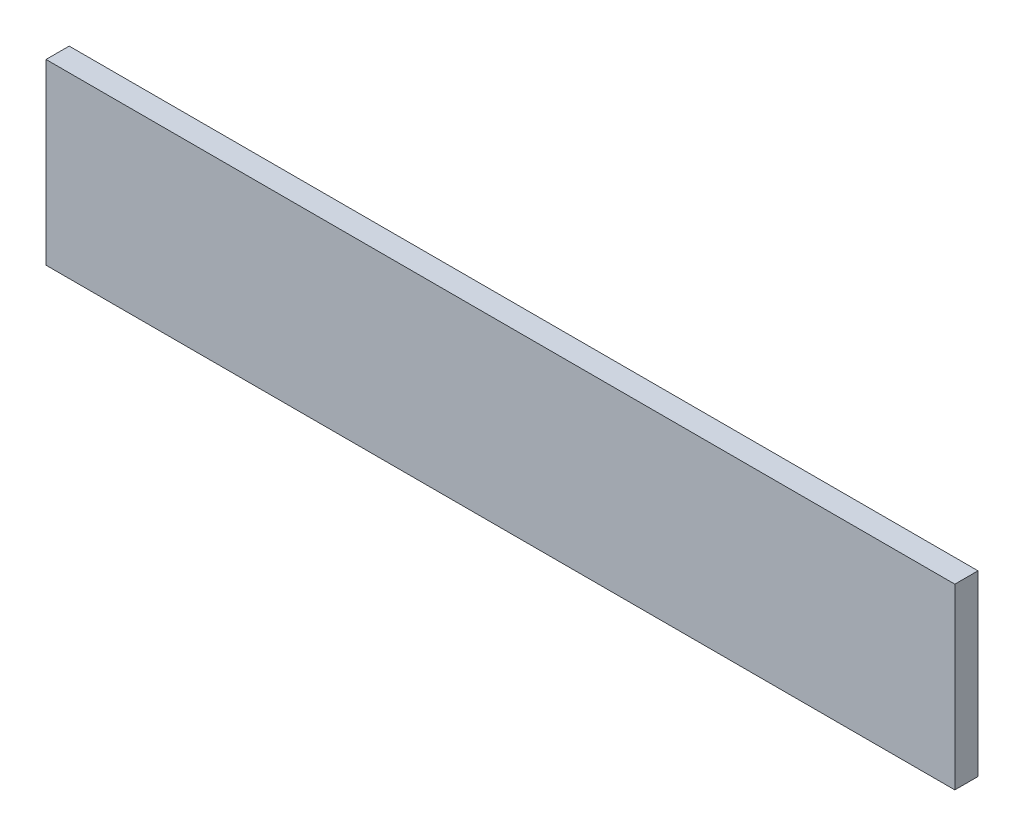
ISO-10303-21;
HEADER;
FILE_DESCRIPTION(('STEP AP214'),'2;1');
FILE_NAME('part.step','',(''),(''),'','','');
FILE_SCHEMA(('AUTOMOTIVE_DESIGN { 1 0 10303 214 1 1 1 1 }'));
ENDSEC;
DATA;
#1=APPLICATION_CONTEXT('core data for automotive mechanical design processes');
#2=APPLICATION_PROTOCOL_DEFINITION('international standard','automotive_design',2000,#1);
#3=PRODUCT_CONTEXT('',#1,'mechanical');
#4=PRODUCT('Part','Part','',(#3));
#5=PRODUCT_RELATED_PRODUCT_CATEGORY('part','',(#4));
#6=PRODUCT_DEFINITION_FORMATION('','',#4);
#7=PRODUCT_DEFINITION_CONTEXT('part definition',#1,'design');
#8=PRODUCT_DEFINITION('design','',#6,#7);
#9=PRODUCT_DEFINITION_SHAPE('','',#8);
#10=(LENGTH_UNIT() NAMED_UNIT(*) SI_UNIT(.MILLI.,.METRE.));
#11=(NAMED_UNIT(*) PLANE_ANGLE_UNIT() SI_UNIT($,.RADIAN.));
#12=(NAMED_UNIT(*) SI_UNIT($,.STERADIAN.) SOLID_ANGLE_UNIT());
#13=UNCERTAINTY_MEASURE_WITH_UNIT(LENGTH_MEASURE(1.E-05),#10,'distance_accuracy_value','');
#14=(GEOMETRIC_REPRESENTATION_CONTEXT(3) GLOBAL_UNCERTAINTY_ASSIGNED_CONTEXT((#13)) GLOBAL_UNIT_ASSIGNED_CONTEXT((#10,
#11,#12)) REPRESENTATION_CONTEXT('',''));
#15=CARTESIAN_POINT('',(0.,0.,0.));
#16=DIRECTION('',(0.,0.,1.));
#17=DIRECTION('',(1.,0.,0.));
#18=AXIS2_PLACEMENT_3D('',#15,#16,#17);
#19=CARTESIAN_POINT('',(-9.80769230769334,-6.15384615384615,0.5));
#20=DIRECTION('',(1.,0.,0.));
#21=DIRECTION('',(0.,0.,-1.));
#22=AXIS2_PLACEMENT_3D('',#19,#20,#21);
#23=PLANE('',#22);
#24=DIRECTION('',(0.,1.,0.));
#25=VECTOR('',#24,1.);
#26=CARTESIAN_POINT('',(-9.80769230769334,-6.15384615384615,1.));
#27=LINE('',#26,#25);
#28=CARTESIAN_POINT('',(-9.80769230769334,-6.15384615384615,1.));
#29=VERTEX_POINT('',#28);
#30=CARTESIAN_POINT('',(-9.80769230769334,-2.30769230769231,1.));
#31=VERTEX_POINT('',#30);
#32=EDGE_CURVE('E105',#29,#31,#27,.T.);
#33=ORIENTED_EDGE('',*,*,#32,.T.);
#34=DIRECTION('',(0.,0.,1.));
#35=VECTOR('',#34,1.);
#36=CARTESIAN_POINT('',(-9.80769230769334,-2.30769230769231,0.5));
#37=LINE('',#36,#35);
#38=CARTESIAN_POINT('',(-9.80769230769334,-2.30769230769231,0.5));
#39=VERTEX_POINT('',#38);
#40=EDGE_CURVE('E11',#39,#31,#37,.T.);
#41=ORIENTED_EDGE('',*,*,#40,.F.);
#42=DIRECTION('',(0.,1.,0.));
#43=VECTOR('',#42,1.);
#44=CARTESIAN_POINT('',(-9.80769230769334,-6.15384615384615,0.5));
#45=LINE('',#44,#43);
#46=CARTESIAN_POINT('',(-9.80769230769334,-6.15384615384615,0.5));
#47=VERTEX_POINT('',#46);
#48=EDGE_CURVE('E89',#47,#39,#45,.T.);
#49=ORIENTED_EDGE('',*,*,#48,.F.);
#50=DIRECTION('',(0.,0.,1.));
#51=VECTOR('',#50,1.);
#52=CARTESIAN_POINT('',(-9.80769230769334,-6.15384615384615,0.5));
#53=LINE('',#52,#51);
#54=EDGE_CURVE('E97',#47,#29,#53,.T.);
#55=ORIENTED_EDGE('',*,*,#54,.T.);
#56=EDGE_LOOP('',(#33,#41,#49,#55));
#57=FACE_BOUND('',#56,.T.);
#58=ADVANCED_FACE('F39',(#57),#23,.F.);
#59=CARTESIAN_POINT('',(-9.80769230769334,-2.30769230769231,0.5));
#60=DIRECTION('',(0.,-1.,0.));
#61=DIRECTION('',(0.,0.,-1.));
#62=AXIS2_PLACEMENT_3D('',#59,#60,#61);
#63=PLANE('',#62);
#64=DIRECTION('',(1.,0.,0.));
#65=VECTOR('',#64,1.);
#66=CARTESIAN_POINT('',(-9.80769230769334,-2.30769230769231,1.));
#67=LINE('',#66,#65);
#68=CARTESIAN_POINT('',(9.80769230769127,-2.30769230769231,1.));
#69=VERTEX_POINT('',#68);
#70=EDGE_CURVE('E92',#31,#69,#67,.T.);
#71=ORIENTED_EDGE('',*,*,#70,.T.);
#72=DIRECTION('',(0.,0.,1.));
#73=VECTOR('',#72,1.);
#74=CARTESIAN_POINT('',(9.80769230769127,-2.30769230769231,0.5));
#75=LINE('',#74,#73);
#76=CARTESIAN_POINT('',(9.80769230769127,-2.30769230769231,0.5));
#77=VERTEX_POINT('',#76);
#78=EDGE_CURVE('E50',#77,#69,#75,.T.);
#79=ORIENTED_EDGE('',*,*,#78,.F.);
#80=DIRECTION('',(1.,0.,0.));
#81=VECTOR('',#80,1.);
#82=CARTESIAN_POINT('',(-9.80769230769334,-2.30769230769231,0.5));
#83=LINE('',#82,#81);
#84=EDGE_CURVE('E82',#39,#77,#83,.T.);
#85=ORIENTED_EDGE('',*,*,#84,.F.);
#86=ORIENTED_EDGE('',*,*,#40,.T.);
#87=EDGE_LOOP('',(#71,#79,#85,#86));
#88=FACE_BOUND('',#87,.T.);
#89=ADVANCED_FACE('F93',(#88),#63,.F.);
#90=CARTESIAN_POINT('',(9.80769230769127,-2.30769230769231,0.5));
#91=DIRECTION('',(-1.,0.,0.));
#92=DIRECTION('',(0.,0.,1.));
#93=AXIS2_PLACEMENT_3D('',#90,#91,#92);
#94=PLANE('',#93);
#95=DIRECTION('',(0.,-1.,0.));
#96=VECTOR('',#95,1.);
#97=CARTESIAN_POINT('',(9.80769230769127,-2.30769230769231,1.));
#98=LINE('',#97,#96);
#99=CARTESIAN_POINT('',(9.80769230769127,-6.15384615384615,1.));
#100=VERTEX_POINT('',#99);
#101=EDGE_CURVE('E74',#69,#100,#98,.T.);
#102=ORIENTED_EDGE('',*,*,#101,.T.);
#103=DIRECTION('',(0.,0.,1.));
#104=VECTOR('',#103,1.);
#105=CARTESIAN_POINT('',(9.80769230769127,-6.15384615384615,0.5));
#106=LINE('',#105,#104);
#107=CARTESIAN_POINT('',(9.80769230769127,-6.15384615384615,0.5));
#108=VERTEX_POINT('',#107);
#109=EDGE_CURVE('E94',#108,#100,#106,.T.);
#110=ORIENTED_EDGE('',*,*,#109,.F.);
#111=DIRECTION('',(0.,-1.,0.));
#112=VECTOR('',#111,1.);
#113=CARTESIAN_POINT('',(9.80769230769127,-2.30769230769231,0.5));
#114=LINE('',#113,#112);
#115=EDGE_CURVE('E88',#77,#108,#114,.T.);
#116=ORIENTED_EDGE('',*,*,#115,.F.);
#117=ORIENTED_EDGE('',*,*,#78,.T.);
#118=EDGE_LOOP('',(#102,#110,#116,#117));
#119=FACE_BOUND('',#118,.T.);
#120=ADVANCED_FACE('F96',(#119),#94,.F.);
#121=CARTESIAN_POINT('',(9.80769230769127,-6.15384615384615,0.5));
#122=DIRECTION('',(0.,1.,0.));
#123=DIRECTION('',(0.,0.,1.));
#124=AXIS2_PLACEMENT_3D('',#121,#122,#123);
#125=PLANE('',#124);
#126=DIRECTION('',(-1.,0.,0.));
#127=VECTOR('',#126,1.);
#128=CARTESIAN_POINT('',(9.80769230769127,-6.15384615384615,1.));
#129=LINE('',#128,#127);
#130=EDGE_CURVE('E76',#100,#29,#129,.T.);
#131=ORIENTED_EDGE('',*,*,#130,.T.);
#132=ORIENTED_EDGE('',*,*,#54,.F.);
#133=DIRECTION('',(-1.,0.,0.));
#134=VECTOR('',#133,1.);
#135=CARTESIAN_POINT('',(9.80769230769127,-6.15384615384615,0.5));
#136=LINE('',#135,#134);
#137=EDGE_CURVE('E54',#108,#47,#136,.T.);
#138=ORIENTED_EDGE('',*,*,#137,.F.);
#139=ORIENTED_EDGE('',*,*,#109,.T.);
#140=EDGE_LOOP('',(#131,#132,#138,#139));
#141=FACE_BOUND('',#140,.T.);
#142=ADVANCED_FACE('F106',(#141),#125,.F.);
#143=CARTESIAN_POINT('',(0.,0.,0.5));
#144=DIRECTION('',(0.,0.,-1.));
#145=DIRECTION('',(-1.,0.,0.));
#146=AXIS2_PLACEMENT_3D('',#143,#144,#145);
#147=PLANE('',#146);
#148=ORIENTED_EDGE('',*,*,#48,.T.);
#149=ORIENTED_EDGE('',*,*,#84,.T.);
#150=ORIENTED_EDGE('',*,*,#115,.T.);
#151=ORIENTED_EDGE('',*,*,#137,.T.);
#152=EDGE_LOOP('',(#148,#149,#150,#151));
#153=FACE_BOUND('',#152,.T.);
#154=ADVANCED_FACE('F86',(#153),#147,.T.);
#155=CARTESIAN_POINT('',(0.,0.,1.));
#156=DIRECTION('',(0.,0.,-1.));
#157=DIRECTION('',(-1.,0.,0.));
#158=AXIS2_PLACEMENT_3D('',#155,#156,#157);
#159=PLANE('',#158);
#160=ORIENTED_EDGE('',*,*,#32,.F.);
#161=ORIENTED_EDGE('',*,*,#130,.F.);
#162=ORIENTED_EDGE('',*,*,#101,.F.);
#163=ORIENTED_EDGE('',*,*,#70,.F.);
#164=EDGE_LOOP('',(#160,#161,#162,#163));
#165=FACE_BOUND('',#164,.T.);
#166=ADVANCED_FACE('F115',(#165),#159,.F.);
#167=CLOSED_SHELL('',(#58,#89,#120,#142,#154,#166));
#168=MANIFOLD_SOLID_BREP('B2',#167);
#169=ADVANCED_BREP_SHAPE_REPRESENTATION('',(#18,#168),#14);
#170=SHAPE_DEFINITION_REPRESENTATION(#9,#169);
ENDSEC;
END-ISO-10303-21;
